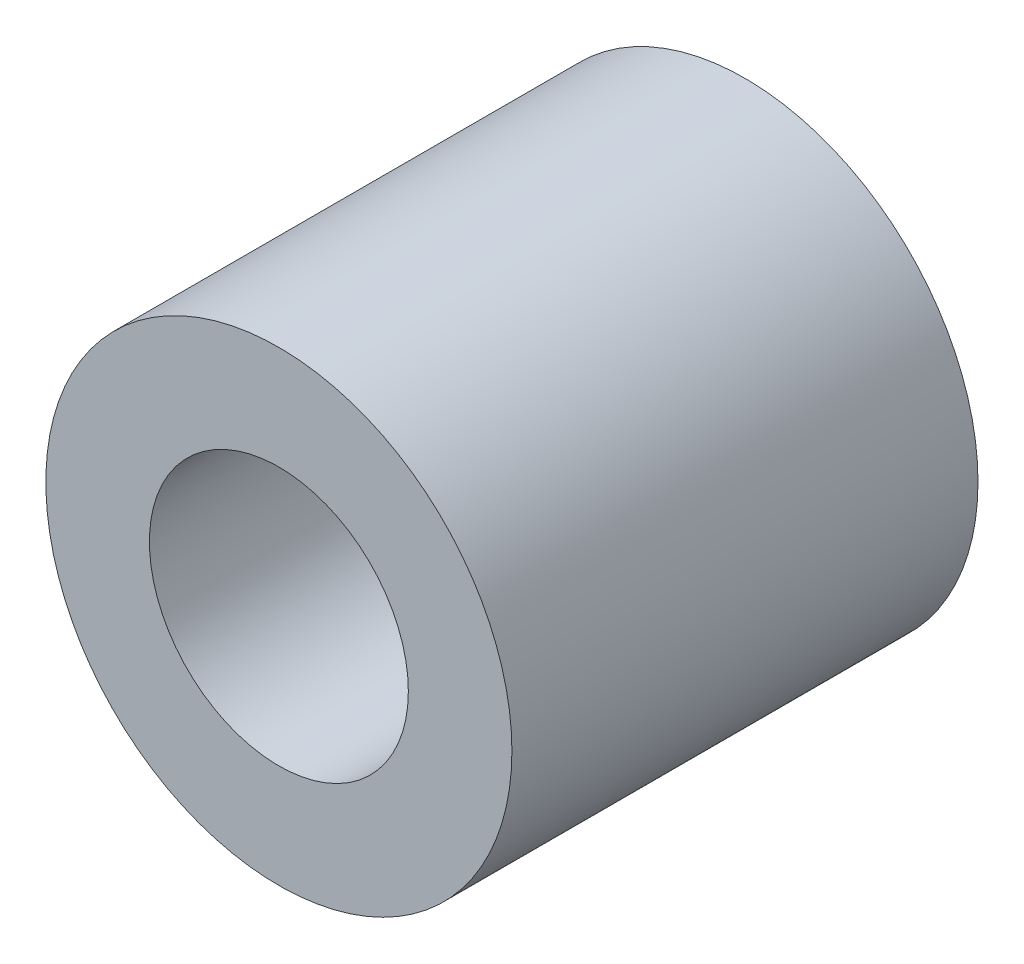
ISO-10303-21;
HEADER;
FILE_DESCRIPTION(('STEP AP214'),'2;1');
FILE_NAME('part.step','',(''),(''),'','','');
FILE_SCHEMA(('AUTOMOTIVE_DESIGN { 1 0 10303 214 1 1 1 1 }'));
ENDSEC;
DATA;
#1=APPLICATION_CONTEXT('core data for automotive mechanical design processes');
#2=APPLICATION_PROTOCOL_DEFINITION('international standard','automotive_design',2000,#1);
#3=PRODUCT_CONTEXT('',#1,'mechanical');
#4=PRODUCT('Part','Part','',(#3));
#5=PRODUCT_RELATED_PRODUCT_CATEGORY('part','',(#4));
#6=PRODUCT_DEFINITION_FORMATION('','',#4);
#7=PRODUCT_DEFINITION_CONTEXT('part definition',#1,'design');
#8=PRODUCT_DEFINITION('design','',#6,#7);
#9=PRODUCT_DEFINITION_SHAPE('','',#8);
#10=(LENGTH_UNIT() NAMED_UNIT(*) SI_UNIT(.MILLI.,.METRE.));
#11=(NAMED_UNIT(*) PLANE_ANGLE_UNIT() SI_UNIT($,.RADIAN.));
#12=(NAMED_UNIT(*) SI_UNIT($,.STERADIAN.) SOLID_ANGLE_UNIT());
#13=UNCERTAINTY_MEASURE_WITH_UNIT(LENGTH_MEASURE(1.E-05),#10,'distance_accuracy_value','');
#14=(GEOMETRIC_REPRESENTATION_CONTEXT(3) GLOBAL_UNCERTAINTY_ASSIGNED_CONTEXT((#13)) GLOBAL_UNIT_ASSIGNED_CONTEXT((#10,
#11,#12)) REPRESENTATION_CONTEXT('',''));
#15=CARTESIAN_POINT('',(0.,0.,0.));
#16=DIRECTION('',(0.,0.,1.));
#17=DIRECTION('',(1.,0.,0.));
#18=AXIS2_PLACEMENT_3D('',#15,#16,#17);
#19=CARTESIAN_POINT('',(0.,0.,9.));
#20=DIRECTION('',(0.,0.,-1.));
#21=DIRECTION('',(-1.,0.,0.));
#22=AXIS2_PLACEMENT_3D('',#19,#20,#21);
#23=CYLINDRICAL_SURFACE('',#22,4.5);
#24=CARTESIAN_POINT('',(0.,0.,9.));
#25=DIRECTION('',(0.,0.,1.));
#26=DIRECTION('',(1.,0.,0.));
#27=AXIS2_PLACEMENT_3D('',#24,#25,#26);
#28=CIRCLE('',#27,4.5);
#29=CARTESIAN_POINT('',(4.5,0.,9.));
#30=VERTEX_POINT('',#29);
#31=EDGE_CURVE('E10',#30,#30,#28,.T.);
#32=ORIENTED_EDGE('',*,*,#31,.F.);
#33=EDGE_LOOP('',(#32));
#34=FACE_BOUND('',#33,.T.);
#35=CARTESIAN_POINT('',(0.,0.,0.));
#36=DIRECTION('',(0.,0.,1.));
#37=DIRECTION('',(1.,0.,0.));
#38=AXIS2_PLACEMENT_3D('',#35,#36,#37);
#39=CIRCLE('',#38,4.5);
#40=CARTESIAN_POINT('',(4.5,0.,0.));
#41=VERTEX_POINT('',#40);
#42=EDGE_CURVE('E40',#41,#41,#39,.T.);
#43=ORIENTED_EDGE('',*,*,#42,.T.);
#44=EDGE_LOOP('',(#43));
#45=FACE_BOUND('',#44,.T.);
#46=ADVANCED_FACE('F37',(#34,#45),#23,.T.);
#47=CARTESIAN_POINT('',(0.,0.,9.));
#48=DIRECTION('',(0.,0.,1.));
#49=DIRECTION('',(1.,0.,0.));
#50=AXIS2_PLACEMENT_3D('',#47,#48,#49);
#51=PLANE('',#50);
#52=CARTESIAN_POINT('',(0.,0.,9.));
#53=DIRECTION('',(0.,0.,1.));
#54=DIRECTION('',(1.,0.,0.));
#55=AXIS2_PLACEMENT_3D('',#52,#53,#54);
#56=CIRCLE('',#55,2.5);
#57=CARTESIAN_POINT('',(2.5,0.,9.));
#58=VERTEX_POINT('',#57);
#59=EDGE_CURVE('E49',#58,#58,#56,.T.);
#60=ORIENTED_EDGE('',*,*,#59,.F.);
#61=EDGE_LOOP('',(#60));
#62=FACE_BOUND('',#61,.T.);
#63=ORIENTED_EDGE('',*,*,#31,.T.);
#64=EDGE_LOOP('',(#63));
#65=FACE_BOUND('',#64,.T.);
#66=ADVANCED_FACE('F77',(#62,#65),#51,.T.);
#67=CARTESIAN_POINT('',(0.,0.,0.));
#68=DIRECTION('',(0.,0.,1.));
#69=DIRECTION('',(1.,0.,0.));
#70=AXIS2_PLACEMENT_3D('',#67,#68,#69);
#71=PLANE('',#70);
#72=CARTESIAN_POINT('',(0.,0.,0.));
#73=DIRECTION('',(0.,0.,1.));
#74=DIRECTION('',(1.,0.,0.));
#75=AXIS2_PLACEMENT_3D('',#72,#73,#74);
#76=CIRCLE('',#75,1.75);
#77=CARTESIAN_POINT('',(1.75,0.,0.));
#78=VERTEX_POINT('',#77);
#79=EDGE_CURVE('E52',#78,#78,#76,.F.);
#80=ORIENTED_EDGE('',*,*,#79,.F.);
#81=EDGE_LOOP('',(#80));
#82=FACE_BOUND('',#81,.T.);
#83=ORIENTED_EDGE('',*,*,#42,.F.);
#84=EDGE_LOOP('',(#83));
#85=FACE_BOUND('',#84,.T.);
#86=ADVANCED_FACE('F73',(#82,#85),#71,.F.);
#87=CARTESIAN_POINT('',(0.,0.,4.7));
#88=DIRECTION('',(0.,0.,1.));
#89=DIRECTION('',(1.,0.,0.));
#90=AXIS2_PLACEMENT_3D('',#87,#88,#89);
#91=CYLINDRICAL_SURFACE('',#90,2.5);
#92=CARTESIAN_POINT('',(0.,0.,4.7));
#93=DIRECTION('',(0.,0.,1.));
#94=DIRECTION('',(1.,0.,0.));
#95=AXIS2_PLACEMENT_3D('',#92,#93,#94);
#96=CIRCLE('',#95,2.5);
#97=CARTESIAN_POINT('',(2.5,0.,4.7));
#98=VERTEX_POINT('',#97);
#99=EDGE_CURVE('E47',#98,#98,#96,.T.);
#100=CARTESIAN_POINT('',(2.5,0.,4.7));
#101=CARTESIAN_POINT('',(2.5,0.,4.74479166666667));
#102=CARTESIAN_POINT('',(2.5,0.,4.78958333333333));
#103=CARTESIAN_POINT('',(2.5,0.,4.87916666666667));
#104=CARTESIAN_POINT('',(2.5,0.,4.92395833333333));
#105=CARTESIAN_POINT('',(2.5,0.,5.01354166666667));
#106=CARTESIAN_POINT('',(2.5,0.,5.05833333333333));
#107=CARTESIAN_POINT('',(2.5,0.,5.14791666666667));
#108=CARTESIAN_POINT('',(2.5,0.,5.19270833333333));
#109=CARTESIAN_POINT('',(2.5,0.,5.28229166666667));
#110=CARTESIAN_POINT('',(2.5,0.,5.32708333333333));
#111=CARTESIAN_POINT('',(2.5,0.,5.41666666666667));
#112=CARTESIAN_POINT('',(2.5,0.,5.46145833333333));
#113=CARTESIAN_POINT('',(2.5,0.,5.55104166666667));
#114=CARTESIAN_POINT('',(2.5,0.,5.59583333333333));
#115=CARTESIAN_POINT('',(2.5,0.,5.68541666666667));
#116=CARTESIAN_POINT('',(2.5,0.,5.73020833333333));
#117=CARTESIAN_POINT('',(2.5,0.,5.81979166666667));
#118=CARTESIAN_POINT('',(2.5,0.,5.86458333333333));
#119=CARTESIAN_POINT('',(2.5,0.,5.95416666666667));
#120=CARTESIAN_POINT('',(2.5,0.,5.99895833333333));
#121=CARTESIAN_POINT('',(2.5,0.,6.08854166666667));
#122=CARTESIAN_POINT('',(2.5,0.,6.13333333333333));
#123=CARTESIAN_POINT('',(2.5,0.,6.22291666666667));
#124=CARTESIAN_POINT('',(2.5,0.,6.26770833333333));
#125=CARTESIAN_POINT('',(2.5,0.,6.35729166666667));
#126=CARTESIAN_POINT('',(2.5,0.,6.40208333333333));
#127=CARTESIAN_POINT('',(2.5,0.,6.49166666666667));
#128=CARTESIAN_POINT('',(2.5,0.,6.53645833333333));
#129=CARTESIAN_POINT('',(2.5,0.,6.62604166666667));
#130=CARTESIAN_POINT('',(2.5,0.,6.67083333333333));
#131=CARTESIAN_POINT('',(2.5,0.,6.76041666666667));
#132=CARTESIAN_POINT('',(2.5,0.,6.80520833333333));
#133=CARTESIAN_POINT('',(2.5,0.,6.89479166666667));
#134=CARTESIAN_POINT('',(2.5,0.,6.93958333333333));
#135=CARTESIAN_POINT('',(2.5,0.,7.02916666666667));
#136=CARTESIAN_POINT('',(2.5,0.,7.07395833333333));
#137=CARTESIAN_POINT('',(2.5,0.,7.16354166666667));
#138=CARTESIAN_POINT('',(2.5,0.,7.20833333333333));
#139=CARTESIAN_POINT('',(2.5,0.,7.29791666666666));
#140=CARTESIAN_POINT('',(2.5,0.,7.34270833333333));
#141=CARTESIAN_POINT('',(2.5,0.,7.43229166666667));
#142=CARTESIAN_POINT('',(2.5,0.,7.47708333333333));
#143=CARTESIAN_POINT('',(2.5,0.,7.56666666666667));
#144=CARTESIAN_POINT('',(2.5,0.,7.61145833333333));
#145=CARTESIAN_POINT('',(2.5,0.,7.70104166666667));
#146=CARTESIAN_POINT('',(2.5,0.,7.74583333333333));
#147=CARTESIAN_POINT('',(2.5,0.,7.83541666666667));
#148=CARTESIAN_POINT('',(2.5,0.,7.88020833333333));
#149=CARTESIAN_POINT('',(2.5,0.,7.96979166666666));
#150=CARTESIAN_POINT('',(2.5,0.,8.01458333333333));
#151=CARTESIAN_POINT('',(2.5,0.,8.10416666666667));
#152=CARTESIAN_POINT('',(2.5,0.,8.14895833333333));
#153=CARTESIAN_POINT('',(2.5,0.,8.23854166666666));
#154=CARTESIAN_POINT('',(2.5,0.,8.28333333333333));
#155=CARTESIAN_POINT('',(2.5,0.,8.37291666666667));
#156=CARTESIAN_POINT('',(2.5,0.,8.41770833333333));
#157=CARTESIAN_POINT('',(2.5,0.,8.50729166666667));
#158=CARTESIAN_POINT('',(2.5,0.,8.55208333333333));
#159=CARTESIAN_POINT('',(2.5,0.,8.64166666666667));
#160=CARTESIAN_POINT('',(2.5,0.,8.68645833333333));
#161=CARTESIAN_POINT('',(2.5,0.,8.77604166666667));
#162=CARTESIAN_POINT('',(2.5,0.,8.82083333333333));
#163=CARTESIAN_POINT('',(2.5,0.,8.91041666666666));
#164=CARTESIAN_POINT('',(2.5,0.,8.95520833333333));
#165=CARTESIAN_POINT('',(2.5,0.,9.));
#166=B_SPLINE_CURVE_WITH_KNOTS('',3,(#100,#101,#102,#103,#104,#105,#106,#107,#108,#109,#110,
#111,#112,#113,#114,#115,#116,#117,#118,#119,#120,#121,#122,#123,#124,#125,#126,#127,#128,#129,
#130,#131,#132,#133,#134,#135,#136,#137,#138,#139,#140,#141,#142,#143,#144,#145,#146,#147,#148,
#149,#150,#151,#152,#153,#154,#155,#156,#157,#158,#159,#160,#161,#162,#163,#164,#165),
.UNSPECIFIED.,.F.,.F.,(4,2,2,2,2,2,2,2,2,2,2,2,2,2,2,2,2,2,2,2,2,2,2,2,2,2,2,2,2,2,2,2,4),(0.,
0.134375,0.26875,0.403125,0.5375,0.671875,0.80625,0.940625,1.075,1.209375,1.34375,1.478125,
1.6125,1.746875,1.88125,2.015625,2.15,2.284375,2.41875,2.553125,2.6875,2.821875,2.95625,
3.090625,3.225,3.359375,3.49375,3.628125,3.7625,3.896875,4.03125,4.165625,4.3),.UNSPECIFIED.);
#167=EDGE_CURVE('BSEAM67',#98,#58,#166,.T.);
#168=ORIENTED_EDGE('',*,*,#99,.F.);
#169=ORIENTED_EDGE('',*,*,#59,.T.);
#170=ORIENTED_EDGE('',*,*,#167,.T.);
#171=ORIENTED_EDGE('',*,*,#167,.F.);
#172=EDGE_LOOP('',(#168,#170,#169,#171));
#173=FACE_BOUND('',#172,.T.);
#174=ADVANCED_FACE('F67',(#173),#91,.F.);
#175=CARTESIAN_POINT('',(0.,0.,4.7));
#176=DIRECTION('',(0.,0.,1.));
#177=DIRECTION('',(1.,0.,0.));
#178=AXIS2_PLACEMENT_3D('',#175,#176,#177);
#179=PLANE('',#178);
#180=CARTESIAN_POINT('',(0.,0.,4.7));
#181=DIRECTION('',(0.,0.,1.));
#182=DIRECTION('',(1.,0.,0.));
#183=AXIS2_PLACEMENT_3D('',#180,#181,#182);
#184=CIRCLE('',#183,1.75);
#185=CARTESIAN_POINT('',(1.75,0.,4.7));
#186=VERTEX_POINT('',#185);
#187=EDGE_CURVE('E57',#186,#186,#184,.T.);
#188=ORIENTED_EDGE('',*,*,#187,.F.);
#189=EDGE_LOOP('',(#188));
#190=FACE_BOUND('',#189,.T.);
#191=ORIENTED_EDGE('',*,*,#99,.T.);
#192=EDGE_LOOP('',(#191));
#193=FACE_BOUND('',#192,.T.);
#194=ADVANCED_FACE('F64',(#190,#193),#179,.T.);
#195=CARTESIAN_POINT('',(0.,0.,-0.00100000000000013));
#196=DIRECTION('',(0.,0.,1.));
#197=DIRECTION('',(1.,0.,0.));
#198=AXIS2_PLACEMENT_3D('',#195,#196,#197);
#199=CYLINDRICAL_SURFACE('',#198,1.75);
#200=ORIENTED_EDGE('',*,*,#187,.T.);
#201=EDGE_LOOP('',(#200));
#202=FACE_BOUND('',#201,.T.);
#203=ORIENTED_EDGE('',*,*,#79,.T.);
#204=EDGE_LOOP('',(#203));
#205=FACE_BOUND('',#204,.T.);
#206=ADVANCED_FACE('F61',(#202,#205),#199,.F.);
#207=CLOSED_SHELL('',(#46,#66,#86,#174,#194,#206));
#208=MANIFOLD_SOLID_BREP('B2',#207);
#209=ADVANCED_BREP_SHAPE_REPRESENTATION('',(#18,#208),#14);
#210=SHAPE_DEFINITION_REPRESENTATION(#9,#209);
ENDSEC;
END-ISO-10303-21;
